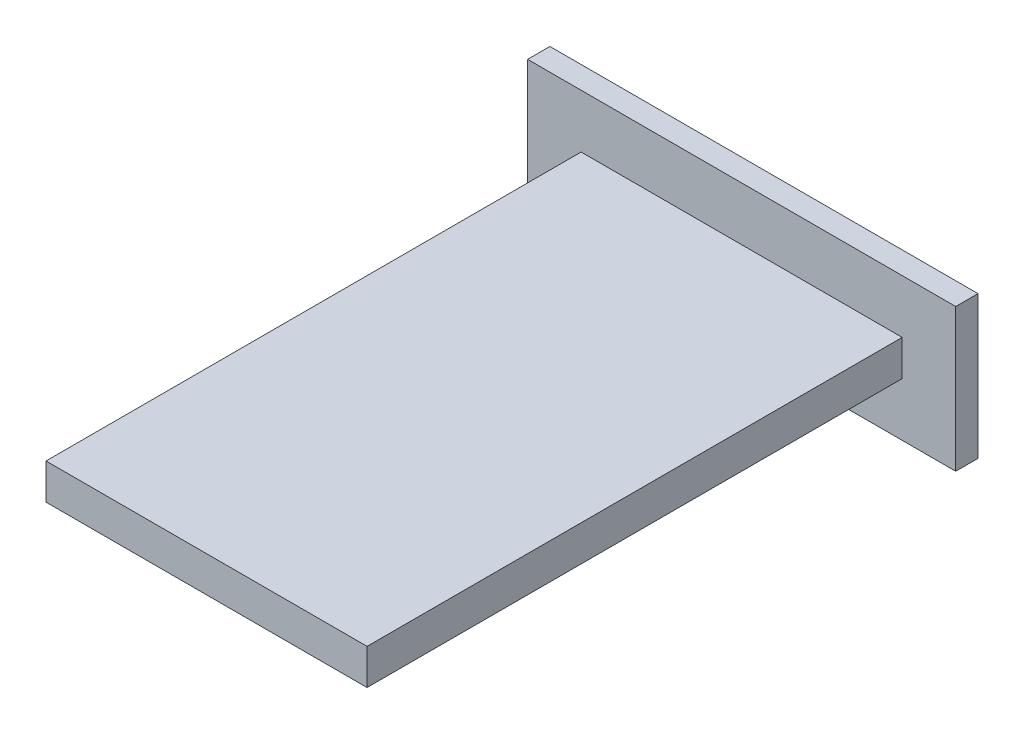
ISO-10303-21;
HEADER;
FILE_DESCRIPTION(('STEP AP214'),'2;1');
FILE_NAME('part.step','',(''),(''),'','','');
FILE_SCHEMA(('AUTOMOTIVE_DESIGN { 1 0 10303 214 1 1 1 1 }'));
ENDSEC;
DATA;
#1=APPLICATION_CONTEXT('core data for automotive mechanical design processes');
#2=APPLICATION_PROTOCOL_DEFINITION('international standard','automotive_design',2000,#1);
#3=PRODUCT_CONTEXT('',#1,'mechanical');
#4=PRODUCT('Part','Part','',(#3));
#5=PRODUCT_RELATED_PRODUCT_CATEGORY('part','',(#4));
#6=PRODUCT_DEFINITION_FORMATION('','',#4);
#7=PRODUCT_DEFINITION_CONTEXT('part definition',#1,'design');
#8=PRODUCT_DEFINITION('design','',#6,#7);
#9=PRODUCT_DEFINITION_SHAPE('','',#8);
#10=(LENGTH_UNIT() NAMED_UNIT(*) SI_UNIT(.MILLI.,.METRE.));
#11=(NAMED_UNIT(*) PLANE_ANGLE_UNIT() SI_UNIT($,.RADIAN.));
#12=(NAMED_UNIT(*) SI_UNIT($,.STERADIAN.) SOLID_ANGLE_UNIT());
#13=UNCERTAINTY_MEASURE_WITH_UNIT(LENGTH_MEASURE(1.E-05),#10,'distance_accuracy_value','');
#14=(GEOMETRIC_REPRESENTATION_CONTEXT(3) GLOBAL_UNCERTAINTY_ASSIGNED_CONTEXT((#13)) GLOBAL_UNIT_ASSIGNED_CONTEXT((#10,
#11,#12)) REPRESENTATION_CONTEXT('',''));
#15=CARTESIAN_POINT('',(0.,0.,0.));
#16=DIRECTION('',(0.,0.,1.));
#17=DIRECTION('',(1.,0.,0.));
#18=AXIS2_PLACEMENT_3D('',#15,#16,#17);
#19=CARTESIAN_POINT('',(9.,2.,15.));
#20=DIRECTION('',(-1.,0.,0.));
#21=DIRECTION('',(0.,0.,1.));
#22=AXIS2_PLACEMENT_3D('',#19,#20,#21);
#23=PLANE('',#22);
#24=DIRECTION('',(0.,0.,-1.));
#25=VECTOR('',#24,1.);
#26=CARTESIAN_POINT('',(9.,0.,15.));
#27=LINE('',#26,#25);
#28=CARTESIAN_POINT('',(9.,0.,15.));
#29=VERTEX_POINT('',#28);
#30=CARTESIAN_POINT('',(9.,0.,-15.));
#31=VERTEX_POINT('',#30);
#32=EDGE_CURVE('E146',#29,#31,#27,.T.);
#33=ORIENTED_EDGE('',*,*,#32,.T.);
#34=DIRECTION('',(0.,-1.,0.));
#35=VECTOR('',#34,1.);
#36=CARTESIAN_POINT('',(9.,2.,-15.));
#37=LINE('',#36,#35);
#38=CARTESIAN_POINT('',(9.,2.,-15.));
#39=VERTEX_POINT('',#38);
#40=EDGE_CURVE('E11',#39,#31,#37,.T.);
#41=ORIENTED_EDGE('',*,*,#40,.F.);
#42=DIRECTION('',(0.,0.,-1.));
#43=VECTOR('',#42,1.);
#44=CARTESIAN_POINT('',(9.,2.,15.));
#45=LINE('',#44,#43);
#46=CARTESIAN_POINT('',(9.,2.,15.));
#47=VERTEX_POINT('',#46);
#48=EDGE_CURVE('E87',#47,#39,#45,.T.);
#49=ORIENTED_EDGE('',*,*,#48,.F.);
#50=DIRECTION('',(0.,-1.,0.));
#51=VECTOR('',#50,1.);
#52=CARTESIAN_POINT('',(9.,2.,15.));
#53=LINE('',#52,#51);
#54=EDGE_CURVE('E165',#47,#29,#53,.T.);
#55=ORIENTED_EDGE('',*,*,#54,.T.);
#56=EDGE_LOOP('',(#33,#41,#49,#55));
#57=FACE_BOUND('',#56,.T.);
#58=ADVANCED_FACE('F45',(#57),#23,.F.);
#59=CARTESIAN_POINT('',(-9.,2.,15.));
#60=DIRECTION('',(1.,0.,0.));
#61=DIRECTION('',(0.,0.,-1.));
#62=AXIS2_PLACEMENT_3D('',#59,#60,#61);
#63=PLANE('',#62);
#64=DIRECTION('',(0.,0.,1.));
#65=VECTOR('',#64,1.);
#66=CARTESIAN_POINT('',(-9.,0.,15.));
#67=LINE('',#66,#65);
#68=CARTESIAN_POINT('',(-9.,0.,-15.));
#69=VERTEX_POINT('',#68);
#70=CARTESIAN_POINT('',(-9.,0.,15.));
#71=VERTEX_POINT('',#70);
#72=EDGE_CURVE('E76',#69,#71,#67,.T.);
#73=ORIENTED_EDGE('',*,*,#72,.T.);
#74=DIRECTION('',(0.,-1.,0.));
#75=VECTOR('',#74,1.);
#76=CARTESIAN_POINT('',(-9.,2.,15.));
#77=LINE('',#76,#75);
#78=CARTESIAN_POINT('',(-9.,2.,15.));
#79=VERTEX_POINT('',#78);
#80=EDGE_CURVE('E176',#79,#71,#77,.T.);
#81=ORIENTED_EDGE('',*,*,#80,.F.);
#82=DIRECTION('',(0.,0.,1.));
#83=VECTOR('',#82,1.);
#84=CARTESIAN_POINT('',(-9.,2.,15.));
#85=LINE('',#84,#83);
#86=CARTESIAN_POINT('',(-9.,2.,-15.));
#87=VERTEX_POINT('',#86);
#88=EDGE_CURVE('E161',#87,#79,#85,.T.);
#89=ORIENTED_EDGE('',*,*,#88,.F.);
#90=DIRECTION('',(0.,-1.,0.));
#91=VECTOR('',#90,1.);
#92=CARTESIAN_POINT('',(-9.,2.,-15.));
#93=LINE('',#92,#91);
#94=EDGE_CURVE('E54',#87,#69,#93,.T.);
#95=ORIENTED_EDGE('',*,*,#94,.T.);
#96=EDGE_LOOP('',(#73,#81,#89,#95));
#97=FACE_BOUND('',#96,.T.);
#98=ADVANCED_FACE('F181',(#97),#63,.F.);
#99=CARTESIAN_POINT('',(-9.,2.,15.));
#100=DIRECTION('',(0.,0.,-1.));
#101=DIRECTION('',(-1.,0.,0.));
#102=AXIS2_PLACEMENT_3D('',#99,#100,#101);
#103=PLANE('',#102);
#104=DIRECTION('',(1.,0.,0.));
#105=VECTOR('',#104,1.);
#106=CARTESIAN_POINT('',(-9.,0.,15.));
#107=LINE('',#106,#105);
#108=EDGE_CURVE('E82',#71,#29,#107,.T.);
#109=ORIENTED_EDGE('',*,*,#108,.T.);
#110=ORIENTED_EDGE('',*,*,#54,.F.);
#111=DIRECTION('',(1.,0.,0.));
#112=VECTOR('',#111,1.);
#113=CARTESIAN_POINT('',(-9.,2.,15.));
#114=LINE('',#113,#112);
#115=EDGE_CURVE('E62',#79,#47,#114,.T.);
#116=ORIENTED_EDGE('',*,*,#115,.F.);
#117=ORIENTED_EDGE('',*,*,#80,.T.);
#118=EDGE_LOOP('',(#109,#110,#116,#117));
#119=FACE_BOUND('',#118,.T.);
#120=ADVANCED_FACE('F191',(#119),#103,.F.);
#121=CARTESIAN_POINT('',(0.,2.,0.));
#122=DIRECTION('',(0.,-1.,0.));
#123=DIRECTION('',(0.,0.,-1.));
#124=AXIS2_PLACEMENT_3D('',#121,#122,#123);
#125=PLANE('',#124);
#126=ORIENTED_EDGE('',*,*,#48,.T.);
#127=DIRECTION('',(-1.,0.,0.));
#128=VECTOR('',#127,1.);
#129=CARTESIAN_POINT('',(-9.,2.,-15.));
#130=LINE('',#129,#128);
#131=EDGE_CURVE('E158',#39,#87,#130,.T.);
#132=ORIENTED_EDGE('',*,*,#131,.T.);
#133=ORIENTED_EDGE('',*,*,#88,.T.);
#134=ORIENTED_EDGE('',*,*,#115,.T.);
#135=EDGE_LOOP('',(#126,#132,#133,#134));
#136=FACE_BOUND('',#135,.T.);
#137=ADVANCED_FACE('F193',(#136),#125,.F.);
#138=CARTESIAN_POINT('',(0.,0.,0.));
#139=DIRECTION('',(0.,-1.,0.));
#140=DIRECTION('',(0.,0.,-1.));
#141=AXIS2_PLACEMENT_3D('',#138,#139,#140);
#142=PLANE('',#141);
#143=ORIENTED_EDGE('',*,*,#32,.F.);
#144=ORIENTED_EDGE('',*,*,#108,.F.);
#145=ORIENTED_EDGE('',*,*,#72,.F.);
#146=DIRECTION('',(-1.,0.,0.));
#147=VECTOR('',#146,1.);
#148=CARTESIAN_POINT('',(-9.,0.,-15.));
#149=LINE('',#148,#147);
#150=EDGE_CURVE('E150',#31,#69,#149,.T.);
#151=ORIENTED_EDGE('',*,*,#150,.F.);
#152=EDGE_LOOP('',(#143,#144,#145,#151));
#153=FACE_BOUND('',#152,.T.);
#154=ADVANCED_FACE('F187',(#153),#142,.T.);
#155=CARTESIAN_POINT('',(-12.,-3.,-16.25));
#156=DIRECTION('',(1.,0.,0.));
#157=DIRECTION('',(0.,1.,0.));
#158=AXIS2_PLACEMENT_3D('',#155,#156,#157);
#159=PLANE('',#158);
#160=DIRECTION('',(0.,1.,0.));
#161=VECTOR('',#160,1.);
#162=CARTESIAN_POINT('',(-12.,-3.,-15.));
#163=LINE('',#162,#161);
#164=CARTESIAN_POINT('',(-12.,-3.,-15.));
#165=VERTEX_POINT('',#164);
#166=CARTESIAN_POINT('',(-12.,5.,-15.));
#167=VERTEX_POINT('',#166);
#168=EDGE_CURVE('E144',#165,#167,#163,.T.);
#169=ORIENTED_EDGE('',*,*,#168,.T.);
#170=DIRECTION('',(0.,0.,1.));
#171=VECTOR('',#170,1.);
#172=CARTESIAN_POINT('',(-12.,5.,-16.25));
#173=LINE('',#172,#171);
#174=CARTESIAN_POINT('',(-12.,5.,-16.25));
#175=VERTEX_POINT('',#174);
#176=EDGE_CURVE('E122',#175,#167,#173,.T.);
#177=ORIENTED_EDGE('',*,*,#176,.F.);
#178=DIRECTION('',(0.,1.,0.));
#179=VECTOR('',#178,1.);
#180=CARTESIAN_POINT('',(-12.,-3.,-16.25));
#181=LINE('',#180,#179);
#182=CARTESIAN_POINT('',(-12.,-3.,-16.25));
#183=VERTEX_POINT('',#182);
#184=EDGE_CURVE('E130',#183,#175,#181,.T.);
#185=ORIENTED_EDGE('',*,*,#184,.F.);
#186=DIRECTION('',(0.,0.,1.));
#187=VECTOR('',#186,1.);
#188=CARTESIAN_POINT('',(-12.,-3.,-16.25));
#189=LINE('',#188,#187);
#190=EDGE_CURVE('E285',#183,#165,#189,.T.);
#191=ORIENTED_EDGE('',*,*,#190,.T.);
#192=EDGE_LOOP('',(#169,#177,#185,#191));
#193=FACE_BOUND('',#192,.T.);
#194=ADVANCED_FACE('F142',(#193),#159,.F.);
#195=CARTESIAN_POINT('',(12.,5.,-16.25));
#196=DIRECTION('',(0.,-1.,0.));
#197=DIRECTION('',(0.,0.,-1.));
#198=AXIS2_PLACEMENT_3D('',#195,#196,#197);
#199=PLANE('',#198);
#200=DIRECTION('',(1.,0.,0.));
#201=VECTOR('',#200,1.);
#202=CARTESIAN_POINT('',(12.,5.,-15.));
#203=LINE('',#202,#201);
#204=CARTESIAN_POINT('',(12.,5.,-15.));
#205=VERTEX_POINT('',#204);
#206=EDGE_CURVE('E293',#167,#205,#203,.T.);
#207=ORIENTED_EDGE('',*,*,#206,.T.);
#208=DIRECTION('',(0.,0.,1.));
#209=VECTOR('',#208,1.);
#210=CARTESIAN_POINT('',(12.,5.,-16.25));
#211=LINE('',#210,#209);
#212=CARTESIAN_POINT('',(12.,5.,-16.25));
#213=VERTEX_POINT('',#212);
#214=EDGE_CURVE('E125',#213,#205,#211,.T.);
#215=ORIENTED_EDGE('',*,*,#214,.F.);
#216=DIRECTION('',(1.,0.,0.));
#217=VECTOR('',#216,1.);
#218=CARTESIAN_POINT('',(12.,5.,-16.25));
#219=LINE('',#218,#217);
#220=EDGE_CURVE('E118',#175,#213,#219,.T.);
#221=ORIENTED_EDGE('',*,*,#220,.F.);
#222=ORIENTED_EDGE('',*,*,#176,.T.);
#223=EDGE_LOOP('',(#207,#215,#221,#222));
#224=FACE_BOUND('',#223,.T.);
#225=ADVANCED_FACE('F120',(#224),#199,.F.);
#226=CARTESIAN_POINT('',(12.,-3.,-16.25));
#227=DIRECTION('',(-1.,0.,0.));
#228=DIRECTION('',(0.,-1.,0.));
#229=AXIS2_PLACEMENT_3D('',#226,#227,#228);
#230=PLANE('',#229);
#231=DIRECTION('',(0.,-1.,0.));
#232=VECTOR('',#231,1.);
#233=CARTESIAN_POINT('',(12.,-3.,-15.));
#234=LINE('',#233,#232);
#235=CARTESIAN_POINT('',(12.,-3.,-15.));
#236=VERTEX_POINT('',#235);
#237=EDGE_CURVE('E289',#205,#236,#234,.T.);
#238=ORIENTED_EDGE('',*,*,#237,.T.);
#239=DIRECTION('',(0.,0.,1.));
#240=VECTOR('',#239,1.);
#241=CARTESIAN_POINT('',(12.,-3.,-16.25));
#242=LINE('',#241,#240);
#243=CARTESIAN_POINT('',(12.,-3.,-16.25));
#244=VERTEX_POINT('',#243);
#245=EDGE_CURVE('E152',#244,#236,#242,.T.);
#246=ORIENTED_EDGE('',*,*,#245,.F.);
#247=DIRECTION('',(0.,-1.,0.));
#248=VECTOR('',#247,1.);
#249=CARTESIAN_POINT('',(12.,-3.,-16.25));
#250=LINE('',#249,#248);
#251=EDGE_CURVE('E129',#213,#244,#250,.T.);
#252=ORIENTED_EDGE('',*,*,#251,.F.);
#253=ORIENTED_EDGE('',*,*,#214,.T.);
#254=EDGE_LOOP('',(#238,#246,#252,#253));
#255=FACE_BOUND('',#254,.T.);
#256=ADVANCED_FACE('F234',(#255),#230,.F.);
#257=CARTESIAN_POINT('',(12.,-3.,-16.25));
#258=DIRECTION('',(0.,1.,0.));
#259=DIRECTION('',(0.,0.,1.));
#260=AXIS2_PLACEMENT_3D('',#257,#258,#259);
#261=PLANE('',#260);
#262=DIRECTION('',(-1.,0.,0.));
#263=VECTOR('',#262,1.);
#264=CARTESIAN_POINT('',(12.,-3.,-15.));
#265=LINE('',#264,#263);
#266=EDGE_CURVE('E140',#236,#165,#265,.T.);
#267=ORIENTED_EDGE('',*,*,#266,.T.);
#268=ORIENTED_EDGE('',*,*,#190,.F.);
#269=DIRECTION('',(-1.,0.,0.));
#270=VECTOR('',#269,1.);
#271=CARTESIAN_POINT('',(12.,-3.,-16.25));
#272=LINE('',#271,#270);
#273=EDGE_CURVE('E135',#244,#183,#272,.T.);
#274=ORIENTED_EDGE('',*,*,#273,.F.);
#275=ORIENTED_EDGE('',*,*,#245,.T.);
#276=EDGE_LOOP('',(#267,#268,#274,#275));
#277=FACE_BOUND('',#276,.T.);
#278=ADVANCED_FACE('F242',(#277),#261,.F.);
#279=CARTESIAN_POINT('',(0.,0.,-16.25));
#280=DIRECTION('',(0.,0.,1.));
#281=DIRECTION('',(1.,0.,0.));
#282=AXIS2_PLACEMENT_3D('',#279,#280,#281);
#283=PLANE('',#282);
#284=ORIENTED_EDGE('',*,*,#184,.T.);
#285=ORIENTED_EDGE('',*,*,#220,.T.);
#286=ORIENTED_EDGE('',*,*,#251,.T.);
#287=ORIENTED_EDGE('',*,*,#273,.T.);
#288=EDGE_LOOP('',(#284,#285,#286,#287));
#289=FACE_BOUND('',#288,.T.);
#290=ADVANCED_FACE('F133',(#289),#283,.F.);
#291=CARTESIAN_POINT('',(0.,0.,-15.));
#292=DIRECTION('',(0.,0.,1.));
#293=DIRECTION('',(1.,0.,0.));
#294=AXIS2_PLACEMENT_3D('',#291,#292,#293);
#295=PLANE('',#294);
#296=ORIENTED_EDGE('',*,*,#40,.T.);
#297=ORIENTED_EDGE('',*,*,#150,.T.);
#298=ORIENTED_EDGE('',*,*,#94,.F.);
#299=ORIENTED_EDGE('',*,*,#131,.F.);
#300=EDGE_LOOP('',(#296,#297,#298,#299));
#301=FACE_BOUND('',#300,.T.);
#302=ORIENTED_EDGE('',*,*,#168,.F.);
#303=ORIENTED_EDGE('',*,*,#266,.F.);
#304=ORIENTED_EDGE('',*,*,#237,.F.);
#305=ORIENTED_EDGE('',*,*,#206,.F.);
#306=EDGE_LOOP('',(#302,#303,#304,#305));
#307=FACE_BOUND('',#306,.T.);
#308=ADVANCED_FACE('F188',(#301,#307),#295,.T.);
#309=CLOSED_SHELL('',(#58,#98,#120,#137,#154,#194,#225,#256,#278,#290,#308));
#310=MANIFOLD_SOLID_BREP('B2',#309);
#311=ADVANCED_BREP_SHAPE_REPRESENTATION('',(#18,#310),#14);
#312=SHAPE_DEFINITION_REPRESENTATION(#9,#311);
ENDSEC;
END-ISO-10303-21;
